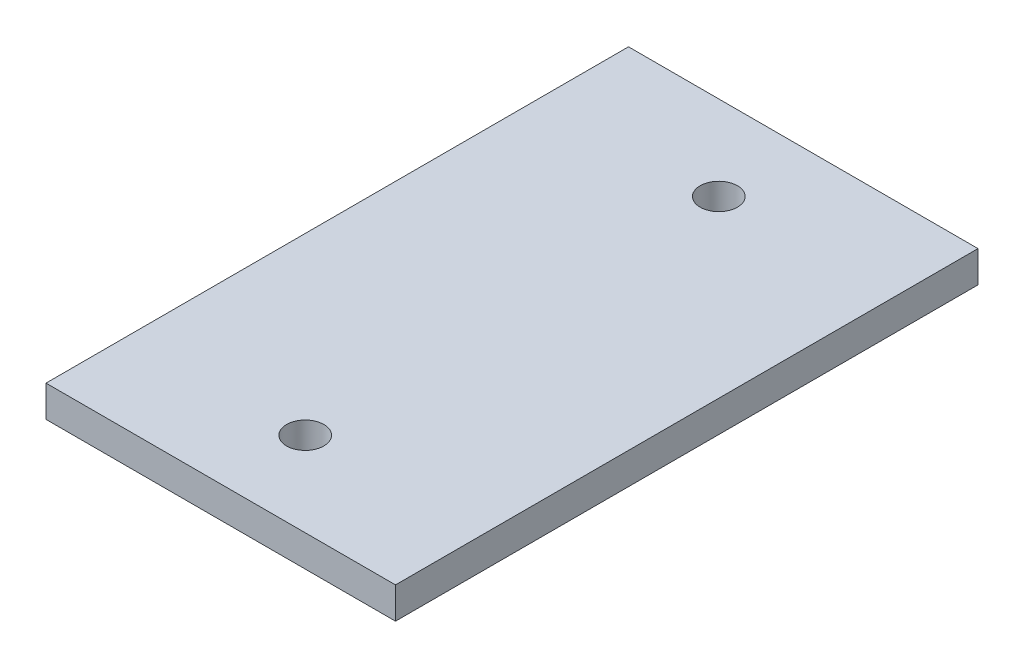
ISO-10303-21;
HEADER;
FILE_DESCRIPTION(('STEP AP214'),'2;1');
FILE_NAME('part.step','',(''),(''),'','','');
FILE_SCHEMA(('AUTOMOTIVE_DESIGN { 1 0 10303 214 1 1 1 1 }'));
ENDSEC;
DATA;
#1=APPLICATION_CONTEXT('core data for automotive mechanical design processes');
#2=APPLICATION_PROTOCOL_DEFINITION('international standard','automotive_design',2000,#1);
#3=PRODUCT_CONTEXT('',#1,'mechanical');
#4=PRODUCT('Part','Part','',(#3));
#5=PRODUCT_RELATED_PRODUCT_CATEGORY('part','',(#4));
#6=PRODUCT_DEFINITION_FORMATION('','',#4);
#7=PRODUCT_DEFINITION_CONTEXT('part definition',#1,'design');
#8=PRODUCT_DEFINITION('design','',#6,#7);
#9=PRODUCT_DEFINITION_SHAPE('','',#8);
#10=(LENGTH_UNIT() NAMED_UNIT(*) SI_UNIT(.MILLI.,.METRE.));
#11=(NAMED_UNIT(*) PLANE_ANGLE_UNIT() SI_UNIT($,.RADIAN.));
#12=(NAMED_UNIT(*) SI_UNIT($,.STERADIAN.) SOLID_ANGLE_UNIT());
#13=UNCERTAINTY_MEASURE_WITH_UNIT(LENGTH_MEASURE(1.E-05),#10,'distance_accuracy_value','');
#14=(GEOMETRIC_REPRESENTATION_CONTEXT(3) GLOBAL_UNCERTAINTY_ASSIGNED_CONTEXT((#13)) GLOBAL_UNIT_ASSIGNED_CONTEXT((#10,
#11,#12)) REPRESENTATION_CONTEXT('',''));
#15=CARTESIAN_POINT('',(0.,0.,0.));
#16=DIRECTION('',(0.,0.,1.));
#17=DIRECTION('',(1.,0.,0.));
#18=AXIS2_PLACEMENT_3D('',#15,#16,#17);
#19=CARTESIAN_POINT('',(0.,2.7,0.));
#20=DIRECTION('',(0.,1.,0.));
#21=DIRECTION('',(0.,0.,1.));
#22=AXIS2_PLACEMENT_3D('',#19,#20,#21);
#23=PLANE('',#22);
#24=CARTESIAN_POINT('',(0.,2.7,-17.75));
#25=DIRECTION('',(0.,1.,0.));
#26=DIRECTION('',(0.,0.,1.));
#27=AXIS2_PLACEMENT_3D('',#24,#25,#26);
#28=CIRCLE('',#27,1.6);
#29=CARTESIAN_POINT('',(0.,2.7,-19.35));
#30=VERTEX_POINT('',#29);
#31=EDGE_CURVE('E118',#30,#30,#28,.T.);
#32=ORIENTED_EDGE('',*,*,#31,.F.);
#33=EDGE_LOOP('',(#32));
#34=FACE_BOUND('',#33,.T.);
#35=DIRECTION('',(0.,0.,-1.));
#36=VECTOR('',#35,1.);
#37=CARTESIAN_POINT('',(15.,2.7,-25.));
#38=LINE('',#37,#36);
#39=CARTESIAN_POINT('',(15.,2.7,25.));
#40=VERTEX_POINT('',#39);
#41=CARTESIAN_POINT('',(15.,2.7,-25.));
#42=VERTEX_POINT('',#41);
#43=EDGE_CURVE('E98',#40,#42,#38,.T.);
#44=ORIENTED_EDGE('',*,*,#43,.T.);
#45=DIRECTION('',(-1.,0.,0.));
#46=VECTOR('',#45,1.);
#47=CARTESIAN_POINT('',(-15.,2.7,-25.));
#48=LINE('',#47,#46);
#49=CARTESIAN_POINT('',(-15.,2.7,-25.));
#50=VERTEX_POINT('',#49);
#51=EDGE_CURVE('E93',#42,#50,#48,.T.);
#52=ORIENTED_EDGE('',*,*,#51,.T.);
#53=DIRECTION('',(0.,0.,1.));
#54=VECTOR('',#53,1.);
#55=CARTESIAN_POINT('',(-15.,2.7,-25.));
#56=LINE('',#55,#54);
#57=CARTESIAN_POINT('',(-15.,2.7,25.));
#58=VERTEX_POINT('',#57);
#59=EDGE_CURVE('E96',#50,#58,#56,.T.);
#60=ORIENTED_EDGE('',*,*,#59,.T.);
#61=DIRECTION('',(1.,0.,0.));
#62=VECTOR('',#61,1.);
#63=CARTESIAN_POINT('',(-15.,2.7,25.));
#64=LINE('',#63,#62);
#65=EDGE_CURVE('E63',#58,#40,#64,.T.);
#66=ORIENTED_EDGE('',*,*,#65,.T.);
#67=EDGE_LOOP('',(#44,#52,#60,#66));
#68=FACE_BOUND('',#67,.T.);
#69=CARTESIAN_POINT('',(0.,2.7,17.75));
#70=DIRECTION('',(0.,1.,0.));
#71=DIRECTION('',(0.,0.,-1.));
#72=AXIS2_PLACEMENT_3D('',#69,#70,#71);
#73=CIRCLE('',#72,1.6);
#74=CARTESIAN_POINT('',(0.,2.7,16.15));
#75=VERTEX_POINT('',#74);
#76=EDGE_CURVE('E140',#75,#75,#73,.T.);
#77=ORIENTED_EDGE('',*,*,#76,.F.);
#78=EDGE_LOOP('',(#77));
#79=FACE_BOUND('',#78,.T.);
#80=ADVANCED_FACE('F45',(#34,#68,#79),#23,.T.);
#81=CARTESIAN_POINT('',(0.,0.,0.));
#82=DIRECTION('',(0.,1.,0.));
#83=DIRECTION('',(0.,0.,1.));
#84=AXIS2_PLACEMENT_3D('',#81,#82,#83);
#85=PLANE('',#84);
#86=DIRECTION('',(0.,0.,-1.));
#87=VECTOR('',#86,1.);
#88=CARTESIAN_POINT('',(15.,0.,-25.));
#89=LINE('',#88,#87);
#90=CARTESIAN_POINT('',(15.,0.,25.));
#91=VERTEX_POINT('',#90);
#92=CARTESIAN_POINT('',(15.,0.,-25.));
#93=VERTEX_POINT('',#92);
#94=EDGE_CURVE('E114',#91,#93,#89,.T.);
#95=ORIENTED_EDGE('',*,*,#94,.F.);
#96=DIRECTION('',(1.,0.,0.));
#97=VECTOR('',#96,1.);
#98=CARTESIAN_POINT('',(-15.,0.,25.));
#99=LINE('',#98,#97);
#100=CARTESIAN_POINT('',(-15.,0.,25.));
#101=VERTEX_POINT('',#100);
#102=EDGE_CURVE('E86',#101,#91,#99,.T.);
#103=ORIENTED_EDGE('',*,*,#102,.F.);
#104=DIRECTION('',(0.,0.,1.));
#105=VECTOR('',#104,1.);
#106=CARTESIAN_POINT('',(-15.,0.,-25.));
#107=LINE('',#106,#105);
#108=CARTESIAN_POINT('',(-15.,0.,-25.));
#109=VERTEX_POINT('',#108);
#110=EDGE_CURVE('E80',#109,#101,#107,.T.);
#111=ORIENTED_EDGE('',*,*,#110,.F.);
#112=DIRECTION('',(-1.,0.,0.));
#113=VECTOR('',#112,1.);
#114=CARTESIAN_POINT('',(-15.,0.,-25.));
#115=LINE('',#114,#113);
#116=EDGE_CURVE('E103',#93,#109,#115,.T.);
#117=ORIENTED_EDGE('',*,*,#116,.F.);
#118=EDGE_LOOP('',(#95,#103,#111,#117));
#119=FACE_BOUND('',#118,.T.);
#120=CARTESIAN_POINT('',(0.,0.,-17.75));
#121=DIRECTION('',(0.,1.,0.));
#122=DIRECTION('',(0.,0.,1.));
#123=AXIS2_PLACEMENT_3D('',#120,#121,#122);
#124=CIRCLE('',#123,1.6);
#125=CARTESIAN_POINT('',(0.,0.,-19.35));
#126=VERTEX_POINT('',#125);
#127=EDGE_CURVE('E136',#126,#126,#124,.T.);
#128=ORIENTED_EDGE('',*,*,#127,.T.);
#129=EDGE_LOOP('',(#128));
#130=FACE_BOUND('',#129,.T.);
#131=CARTESIAN_POINT('',(0.,0.,17.75));
#132=DIRECTION('',(0.,1.,0.));
#133=DIRECTION('',(0.,0.,-1.));
#134=AXIS2_PLACEMENT_3D('',#131,#132,#133);
#135=CIRCLE('',#134,1.6);
#136=CARTESIAN_POINT('',(0.,0.,16.15));
#137=VERTEX_POINT('',#136);
#138=EDGE_CURVE('E144',#137,#137,#135,.T.);
#139=ORIENTED_EDGE('',*,*,#138,.T.);
#140=EDGE_LOOP('',(#139));
#141=FACE_BOUND('',#140,.T.);
#142=ADVANCED_FACE('F131',(#119,#130,#141),#85,.F.);
#143=CARTESIAN_POINT('',(15.,2.7,-25.));
#144=DIRECTION('',(-1.,0.,0.));
#145=DIRECTION('',(0.,0.,1.));
#146=AXIS2_PLACEMENT_3D('',#143,#144,#145);
#147=PLANE('',#146);
#148=ORIENTED_EDGE('',*,*,#94,.T.);
#149=DIRECTION('',(0.,-1.,0.));
#150=VECTOR('',#149,1.);
#151=CARTESIAN_POINT('',(15.,2.7,-25.));
#152=LINE('',#151,#150);
#153=EDGE_CURVE('E11',#42,#93,#152,.T.);
#154=ORIENTED_EDGE('',*,*,#153,.F.);
#155=ORIENTED_EDGE('',*,*,#43,.F.);
#156=DIRECTION('',(0.,-1.,0.));
#157=VECTOR('',#156,1.);
#158=CARTESIAN_POINT('',(15.,2.7,25.));
#159=LINE('',#158,#157);
#160=EDGE_CURVE('E110',#40,#91,#159,.T.);
#161=ORIENTED_EDGE('',*,*,#160,.T.);
#162=EDGE_LOOP('',(#148,#154,#155,#161));
#163=FACE_BOUND('',#162,.T.);
#164=ADVANCED_FACE('F47',(#163),#147,.F.);
#165=CARTESIAN_POINT('',(-15.,2.7,-25.));
#166=DIRECTION('',(0.,0.,1.));
#167=DIRECTION('',(1.,0.,0.));
#168=AXIS2_PLACEMENT_3D('',#165,#166,#167);
#169=PLANE('',#168);
#170=ORIENTED_EDGE('',*,*,#116,.T.);
#171=DIRECTION('',(0.,-1.,0.));
#172=VECTOR('',#171,1.);
#173=CARTESIAN_POINT('',(-15.,2.7,-25.));
#174=LINE('',#173,#172);
#175=EDGE_CURVE('E55',#50,#109,#174,.T.);
#176=ORIENTED_EDGE('',*,*,#175,.F.);
#177=ORIENTED_EDGE('',*,*,#51,.F.);
#178=ORIENTED_EDGE('',*,*,#153,.T.);
#179=EDGE_LOOP('',(#170,#176,#177,#178));
#180=FACE_BOUND('',#179,.T.);
#181=ADVANCED_FACE('F102',(#180),#169,.F.);
#182=CARTESIAN_POINT('',(-15.,2.7,-25.));
#183=DIRECTION('',(1.,0.,0.));
#184=DIRECTION('',(0.,0.,-1.));
#185=AXIS2_PLACEMENT_3D('',#182,#183,#184);
#186=PLANE('',#185);
#187=ORIENTED_EDGE('',*,*,#110,.T.);
#188=DIRECTION('',(0.,-1.,0.));
#189=VECTOR('',#188,1.);
#190=CARTESIAN_POINT('',(-15.,2.7,25.));
#191=LINE('',#190,#189);
#192=EDGE_CURVE('E105',#58,#101,#191,.T.);
#193=ORIENTED_EDGE('',*,*,#192,.F.);
#194=ORIENTED_EDGE('',*,*,#59,.F.);
#195=ORIENTED_EDGE('',*,*,#175,.T.);
#196=EDGE_LOOP('',(#187,#193,#194,#195));
#197=FACE_BOUND('',#196,.T.);
#198=ADVANCED_FACE('F106',(#197),#186,.F.);
#199=CARTESIAN_POINT('',(-15.,2.7,25.));
#200=DIRECTION('',(0.,0.,-1.));
#201=DIRECTION('',(-1.,0.,0.));
#202=AXIS2_PLACEMENT_3D('',#199,#200,#201);
#203=PLANE('',#202);
#204=ORIENTED_EDGE('',*,*,#102,.T.);
#205=ORIENTED_EDGE('',*,*,#160,.F.);
#206=ORIENTED_EDGE('',*,*,#65,.F.);
#207=ORIENTED_EDGE('',*,*,#192,.T.);
#208=EDGE_LOOP('',(#204,#205,#206,#207));
#209=FACE_BOUND('',#208,.T.);
#210=ADVANCED_FACE('F128',(#209),#203,.F.);
#211=CARTESIAN_POINT('',(0.,2.7,-17.75));
#212=DIRECTION('',(0.,-1.,0.));
#213=DIRECTION('',(0.,0.,-1.));
#214=AXIS2_PLACEMENT_3D('',#211,#212,#213);
#215=CYLINDRICAL_SURFACE('',#214,1.6);
#216=CARTESIAN_POINT('',(0.,2.7,-19.35));
#217=CARTESIAN_POINT('',(0.,2.671875,-19.35));
#218=CARTESIAN_POINT('',(0.,2.64375,-19.35));
#219=CARTESIAN_POINT('',(0.,2.5875,-19.35));
#220=CARTESIAN_POINT('',(0.,2.559375,-19.35));
#221=CARTESIAN_POINT('',(0.,2.503125,-19.35));
#222=CARTESIAN_POINT('',(0.,2.475,-19.35));
#223=CARTESIAN_POINT('',(0.,2.41875,-19.35));
#224=CARTESIAN_POINT('',(0.,2.390625,-19.35));
#225=CARTESIAN_POINT('',(0.,2.334375,-19.35));
#226=CARTESIAN_POINT('',(0.,2.30625,-19.35));
#227=CARTESIAN_POINT('',(0.,2.25,-19.35));
#228=CARTESIAN_POINT('',(0.,2.221875,-19.35));
#229=CARTESIAN_POINT('',(0.,2.165625,-19.35));
#230=CARTESIAN_POINT('',(0.,2.1375,-19.35));
#231=CARTESIAN_POINT('',(0.,2.08125,-19.35));
#232=CARTESIAN_POINT('',(0.,2.053125,-19.35));
#233=CARTESIAN_POINT('',(0.,1.996875,-19.35));
#234=CARTESIAN_POINT('',(0.,1.96875,-19.35));
#235=CARTESIAN_POINT('',(0.,1.9125,-19.35));
#236=CARTESIAN_POINT('',(0.,1.884375,-19.35));
#237=CARTESIAN_POINT('',(0.,1.828125,-19.35));
#238=CARTESIAN_POINT('',(0.,1.8,-19.35));
#239=CARTESIAN_POINT('',(0.,1.74375,-19.35));
#240=CARTESIAN_POINT('',(0.,1.715625,-19.35));
#241=CARTESIAN_POINT('',(0.,1.659375,-19.35));
#242=CARTESIAN_POINT('',(0.,1.63125,-19.35));
#243=CARTESIAN_POINT('',(0.,1.575,-19.35));
#244=CARTESIAN_POINT('',(0.,1.546875,-19.35));
#245=CARTESIAN_POINT('',(0.,1.490625,-19.35));
#246=CARTESIAN_POINT('',(0.,1.4625,-19.35));
#247=CARTESIAN_POINT('',(0.,1.40625,-19.35));
#248=CARTESIAN_POINT('',(0.,1.378125,-19.35));
#249=CARTESIAN_POINT('',(0.,1.321875,-19.35));
#250=CARTESIAN_POINT('',(0.,1.29375,-19.35));
#251=CARTESIAN_POINT('',(0.,1.2375,-19.35));
#252=CARTESIAN_POINT('',(0.,1.209375,-19.35));
#253=CARTESIAN_POINT('',(0.,1.153125,-19.35));
#254=CARTESIAN_POINT('',(0.,1.125,-19.35));
#255=CARTESIAN_POINT('',(0.,1.06875,-19.35));
#256=CARTESIAN_POINT('',(0.,1.040625,-19.35));
#257=CARTESIAN_POINT('',(0.,0.984375,-19.35));
#258=CARTESIAN_POINT('',(0.,0.956249999999999,-19.35));
#259=CARTESIAN_POINT('',(0.,0.899999999999999,-19.35));
#260=CARTESIAN_POINT('',(0.,0.871875,-19.35));
#261=CARTESIAN_POINT('',(0.,0.815624999999999,-19.35));
#262=CARTESIAN_POINT('',(0.,0.787499999999999,-19.35));
#263=CARTESIAN_POINT('',(0.,0.73125,-19.35));
#264=CARTESIAN_POINT('',(0.,0.703125,-19.35));
#265=CARTESIAN_POINT('',(0.,0.646875,-19.35));
#266=CARTESIAN_POINT('',(0.,0.61875,-19.35));
#267=CARTESIAN_POINT('',(0.,0.5625,-19.35));
#268=CARTESIAN_POINT('',(0.,0.534375,-19.35));
#269=CARTESIAN_POINT('',(0.,0.478125,-19.35));
#270=CARTESIAN_POINT('',(0.,0.45,-19.35));
#271=CARTESIAN_POINT('',(0.,0.39375,-19.35));
#272=CARTESIAN_POINT('',(0.,0.365625,-19.35));
#273=CARTESIAN_POINT('',(0.,0.309375,-19.35));
#274=CARTESIAN_POINT('',(0.,0.28125,-19.35));
#275=CARTESIAN_POINT('',(0.,0.225,-19.35));
#276=CARTESIAN_POINT('',(0.,0.196875,-19.35));
#277=CARTESIAN_POINT('',(0.,0.140625,-19.35));
#278=CARTESIAN_POINT('',(0.,0.1125,-19.35));
#279=CARTESIAN_POINT('',(0.,0.0562499999999997,-19.35));
#280=CARTESIAN_POINT('',(0.,0.0281249999999996,-19.35));
#281=CARTESIAN_POINT('',(0.,0.,-19.35));
#282=B_SPLINE_CURVE_WITH_KNOTS('',3,(#216,#217,#218,#219,#220,#221,#222,#223,#224,#225,#226,
#227,#228,#229,#230,#231,#232,#233,#234,#235,#236,#237,#238,#239,#240,#241,#242,#243,#244,#245,
#246,#247,#248,#249,#250,#251,#252,#253,#254,#255,#256,#257,#258,#259,#260,#261,#262,#263,#264,
#265,#266,#267,#268,#269,#270,#271,#272,#273,#274,#275,#276,#277,#278,#279,#280,#281),
.UNSPECIFIED.,.F.,.F.,(4,2,2,2,2,2,2,2,2,2,2,2,2,2,2,2,2,2,2,2,2,2,2,2,2,2,2,2,2,2,2,2,4),(0.,
0.0843750000000003,0.16875,0.253125,0.3375,0.421875,0.50625,0.590625,0.675,0.759375,0.84375,
0.928125000000001,1.0125,1.096875,1.18125,1.265625,1.35,1.434375,1.51875,1.603125,1.6875,
1.771875,1.85625,1.940625,2.025,2.109375,2.19375,2.278125,2.3625,2.446875,2.53125,2.615625,2.7),.UNSPECIFIED.);
#283=EDGE_CURVE('BSEAM163',#30,#126,#282,.T.);
#284=ORIENTED_EDGE('',*,*,#31,.T.);
#285=ORIENTED_EDGE('',*,*,#127,.F.);
#286=ORIENTED_EDGE('',*,*,#283,.T.);
#287=ORIENTED_EDGE('',*,*,#283,.F.);
#288=EDGE_LOOP('',(#284,#286,#285,#287));
#289=FACE_BOUND('',#288,.T.);
#290=ADVANCED_FACE('F163',(#289),#215,.F.);
#291=CARTESIAN_POINT('',(0.,2.7,17.75));
#292=DIRECTION('',(0.,-1.,0.));
#293=DIRECTION('',(0.,0.,-1.));
#294=AXIS2_PLACEMENT_3D('',#291,#292,#293);
#295=CYLINDRICAL_SURFACE('',#294,1.6);
#296=CARTESIAN_POINT('',(0.,2.7,16.15));
#297=CARTESIAN_POINT('',(0.,2.671875,16.15));
#298=CARTESIAN_POINT('',(0.,2.64375,16.15));
#299=CARTESIAN_POINT('',(0.,2.5875,16.15));
#300=CARTESIAN_POINT('',(0.,2.559375,16.15));
#301=CARTESIAN_POINT('',(0.,2.503125,16.15));
#302=CARTESIAN_POINT('',(0.,2.475,16.15));
#303=CARTESIAN_POINT('',(0.,2.41875,16.15));
#304=CARTESIAN_POINT('',(0.,2.390625,16.15));
#305=CARTESIAN_POINT('',(0.,2.334375,16.15));
#306=CARTESIAN_POINT('',(0.,2.30625,16.15));
#307=CARTESIAN_POINT('',(0.,2.25,16.15));
#308=CARTESIAN_POINT('',(0.,2.221875,16.15));
#309=CARTESIAN_POINT('',(0.,2.165625,16.15));
#310=CARTESIAN_POINT('',(0.,2.1375,16.15));
#311=CARTESIAN_POINT('',(0.,2.08125,16.15));
#312=CARTESIAN_POINT('',(0.,2.053125,16.15));
#313=CARTESIAN_POINT('',(0.,1.996875,16.15));
#314=CARTESIAN_POINT('',(0.,1.96875,16.15));
#315=CARTESIAN_POINT('',(0.,1.9125,16.15));
#316=CARTESIAN_POINT('',(0.,1.884375,16.15));
#317=CARTESIAN_POINT('',(0.,1.828125,16.15));
#318=CARTESIAN_POINT('',(0.,1.8,16.15));
#319=CARTESIAN_POINT('',(0.,1.74375,16.15));
#320=CARTESIAN_POINT('',(0.,1.715625,16.15));
#321=CARTESIAN_POINT('',(0.,1.659375,16.15));
#322=CARTESIAN_POINT('',(0.,1.63125,16.15));
#323=CARTESIAN_POINT('',(0.,1.575,16.15));
#324=CARTESIAN_POINT('',(0.,1.546875,16.15));
#325=CARTESIAN_POINT('',(0.,1.490625,16.15));
#326=CARTESIAN_POINT('',(0.,1.4625,16.15));
#327=CARTESIAN_POINT('',(0.,1.40625,16.15));
#328=CARTESIAN_POINT('',(0.,1.378125,16.15));
#329=CARTESIAN_POINT('',(0.,1.321875,16.15));
#330=CARTESIAN_POINT('',(0.,1.29375,16.15));
#331=CARTESIAN_POINT('',(0.,1.2375,16.15));
#332=CARTESIAN_POINT('',(0.,1.209375,16.15));
#333=CARTESIAN_POINT('',(0.,1.153125,16.15));
#334=CARTESIAN_POINT('',(0.,1.125,16.15));
#335=CARTESIAN_POINT('',(0.,1.06875,16.15));
#336=CARTESIAN_POINT('',(0.,1.040625,16.15));
#337=CARTESIAN_POINT('',(0.,0.984375,16.15));
#338=CARTESIAN_POINT('',(0.,0.956249999999999,16.15));
#339=CARTESIAN_POINT('',(0.,0.899999999999999,16.15));
#340=CARTESIAN_POINT('',(0.,0.871875,16.15));
#341=CARTESIAN_POINT('',(0.,0.815624999999999,16.15));
#342=CARTESIAN_POINT('',(0.,0.787499999999999,16.15));
#343=CARTESIAN_POINT('',(0.,0.73125,16.15));
#344=CARTESIAN_POINT('',(0.,0.703125,16.15));
#345=CARTESIAN_POINT('',(0.,0.646875,16.15));
#346=CARTESIAN_POINT('',(0.,0.61875,16.15));
#347=CARTESIAN_POINT('',(0.,0.5625,16.15));
#348=CARTESIAN_POINT('',(0.,0.534375,16.15));
#349=CARTESIAN_POINT('',(0.,0.478125,16.15));
#350=CARTESIAN_POINT('',(0.,0.45,16.15));
#351=CARTESIAN_POINT('',(0.,0.39375,16.15));
#352=CARTESIAN_POINT('',(0.,0.365625,16.15));
#353=CARTESIAN_POINT('',(0.,0.309375,16.15));
#354=CARTESIAN_POINT('',(0.,0.28125,16.15));
#355=CARTESIAN_POINT('',(0.,0.225,16.15));
#356=CARTESIAN_POINT('',(0.,0.196875,16.15));
#357=CARTESIAN_POINT('',(0.,0.140625,16.15));
#358=CARTESIAN_POINT('',(0.,0.1125,16.15));
#359=CARTESIAN_POINT('',(0.,0.0562499999999997,16.15));
#360=CARTESIAN_POINT('',(0.,0.0281249999999996,16.15));
#361=CARTESIAN_POINT('',(0.,0.,16.15));
#362=B_SPLINE_CURVE_WITH_KNOTS('',3,(#296,#297,#298,#299,#300,#301,#302,#303,#304,#305,#306,
#307,#308,#309,#310,#311,#312,#313,#314,#315,#316,#317,#318,#319,#320,#321,#322,#323,#324,#325,
#326,#327,#328,#329,#330,#331,#332,#333,#334,#335,#336,#337,#338,#339,#340,#341,#342,#343,#344,
#345,#346,#347,#348,#349,#350,#351,#352,#353,#354,#355,#356,#357,#358,#359,#360,#361),
.UNSPECIFIED.,.F.,.F.,(4,2,2,2,2,2,2,2,2,2,2,2,2,2,2,2,2,2,2,2,2,2,2,2,2,2,2,2,2,2,2,2,4),(0.,
0.0843750000000003,0.16875,0.253125,0.3375,0.421875,0.50625,0.590625,0.675,0.759375,0.84375,
0.928125000000001,1.0125,1.096875,1.18125,1.265625,1.35,1.434375,1.51875,1.603125,1.6875,
1.771875,1.85625,1.940625,2.025,2.109375,2.19375,2.278125,2.3625,2.446875,2.53125,2.615625,2.7),.UNSPECIFIED.);
#363=EDGE_CURVE('BSEAM152',#75,#137,#362,.T.);
#364=ORIENTED_EDGE('',*,*,#76,.T.);
#365=ORIENTED_EDGE('',*,*,#138,.F.);
#366=ORIENTED_EDGE('',*,*,#363,.T.);
#367=ORIENTED_EDGE('',*,*,#363,.F.);
#368=EDGE_LOOP('',(#364,#366,#365,#367));
#369=FACE_BOUND('',#368,.T.);
#370=ADVANCED_FACE('F152',(#369),#295,.F.);
#371=CLOSED_SHELL('',(#80,#142,#164,#181,#198,#210,#290,#370));
#372=MANIFOLD_SOLID_BREP('B2',#371);
#373=ADVANCED_BREP_SHAPE_REPRESENTATION('',(#18,#372),#14);
#374=SHAPE_DEFINITION_REPRESENTATION(#9,#373);
ENDSEC;
END-ISO-10303-21;
